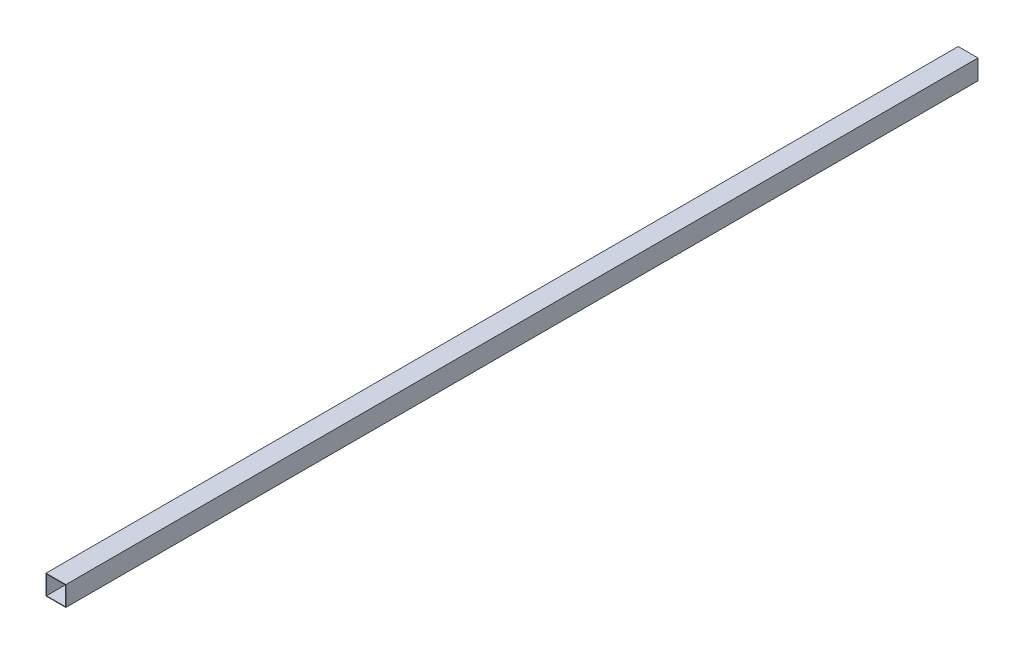
ISO-10303-21;
HEADER;
FILE_DESCRIPTION(('STEP AP214'),'2;1');
FILE_NAME('part.step','',(''),(''),'','','');
FILE_SCHEMA(('AUTOMOTIVE_DESIGN { 1 0 10303 214 1 1 1 1 }'));
ENDSEC;
DATA;
#1=APPLICATION_CONTEXT('core data for automotive mechanical design processes');
#2=APPLICATION_PROTOCOL_DEFINITION('international standard','automotive_design',2000,#1);
#3=PRODUCT_CONTEXT('',#1,'mechanical');
#4=PRODUCT('Part','Part','',(#3));
#5=PRODUCT_RELATED_PRODUCT_CATEGORY('part','',(#4));
#6=PRODUCT_DEFINITION_FORMATION('','',#4);
#7=PRODUCT_DEFINITION_CONTEXT('part definition',#1,'design');
#8=PRODUCT_DEFINITION('design','',#6,#7);
#9=PRODUCT_DEFINITION_SHAPE('','',#8);
#10=(LENGTH_UNIT() NAMED_UNIT(*) SI_UNIT(.MILLI.,.METRE.));
#11=(NAMED_UNIT(*) PLANE_ANGLE_UNIT() SI_UNIT($,.RADIAN.));
#12=(NAMED_UNIT(*) SI_UNIT($,.STERADIAN.) SOLID_ANGLE_UNIT());
#13=UNCERTAINTY_MEASURE_WITH_UNIT(LENGTH_MEASURE(1.E-05),#10,'distance_accuracy_value','');
#14=(GEOMETRIC_REPRESENTATION_CONTEXT(3) GLOBAL_UNCERTAINTY_ASSIGNED_CONTEXT((#13)) GLOBAL_UNIT_ASSIGNED_CONTEXT((#10,
#11,#12)) REPRESENTATION_CONTEXT('',''));
#15=CARTESIAN_POINT('',(0.,0.,0.));
#16=DIRECTION('',(0.,0.,1.));
#17=DIRECTION('',(1.,0.,0.));
#18=AXIS2_PLACEMENT_3D('',#15,#16,#17);
#19=CARTESIAN_POINT('',(0.,0.,1840.));
#20=DIRECTION('',(0.,0.,-1.));
#21=DIRECTION('',(-1.,0.,0.));
#22=AXIS2_PLACEMENT_3D('',#19,#20,#21);
#23=PLANE('',#22);
#24=DIRECTION('',(0.,-1.,0.));
#25=VECTOR('',#24,1.);
#26=CARTESIAN_POINT('',(0.,0.,1840.));
#27=LINE('',#26,#25);
#28=CARTESIAN_POINT('',(0.,40.,1840.));
#29=VERTEX_POINT('',#28);
#30=CARTESIAN_POINT('',(0.,0.,1840.));
#31=VERTEX_POINT('',#30);
#32=EDGE_CURVE('E136',#29,#31,#27,.T.);
#33=ORIENTED_EDGE('',*,*,#32,.T.);
#34=DIRECTION('',(1.,0.,0.));
#35=VECTOR('',#34,1.);
#36=CARTESIAN_POINT('',(0.,0.,1840.));
#37=LINE('',#36,#35);
#38=CARTESIAN_POINT('',(40.,0.,1840.));
#39=VERTEX_POINT('',#38);
#40=EDGE_CURVE('E139',#31,#39,#37,.T.);
#41=ORIENTED_EDGE('',*,*,#40,.T.);
#42=DIRECTION('',(0.,1.,0.));
#43=VECTOR('',#42,1.);
#44=CARTESIAN_POINT('',(40.,0.,1840.));
#45=LINE('',#44,#43);
#46=CARTESIAN_POINT('',(40.,40.,1840.));
#47=VERTEX_POINT('',#46);
#48=EDGE_CURVE('E142',#39,#47,#45,.T.);
#49=ORIENTED_EDGE('',*,*,#48,.T.);
#50=DIRECTION('',(-1.,0.,0.));
#51=VECTOR('',#50,1.);
#52=CARTESIAN_POINT('',(0.,40.,1840.));
#53=LINE('',#52,#51);
#54=EDGE_CURVE('E144',#47,#29,#53,.T.);
#55=ORIENTED_EDGE('',*,*,#54,.T.);
#56=EDGE_LOOP('',(#33,#41,#49,#55));
#57=FACE_BOUND('',#56,.T.);
#58=DIRECTION('',(0.,-1.,0.));
#59=VECTOR('',#58,1.);
#60=CARTESIAN_POINT('',(1.,1.,1840.));
#61=LINE('',#60,#59);
#62=CARTESIAN_POINT('',(1.,39.,1840.));
#63=VERTEX_POINT('',#62);
#64=CARTESIAN_POINT('',(1.,1.,1840.));
#65=VERTEX_POINT('',#64);
#66=EDGE_CURVE('E100',#63,#65,#61,.T.);
#67=ORIENTED_EDGE('',*,*,#66,.F.);
#68=DIRECTION('',(-1.,0.,0.));
#69=VECTOR('',#68,1.);
#70=CARTESIAN_POINT('',(1.,39.,1840.));
#71=LINE('',#70,#69);
#72=CARTESIAN_POINT('',(39.,39.,1840.));
#73=VERTEX_POINT('',#72);
#74=EDGE_CURVE('E122',#73,#63,#71,.T.);
#75=ORIENTED_EDGE('',*,*,#74,.F.);
#76=DIRECTION('',(0.,1.,0.));
#77=VECTOR('',#76,1.);
#78=CARTESIAN_POINT('',(39.,1.,1840.));
#79=LINE('',#78,#77);
#80=CARTESIAN_POINT('',(39.,1.,1840.));
#81=VERTEX_POINT('',#80);
#82=EDGE_CURVE('E120',#81,#73,#79,.T.);
#83=ORIENTED_EDGE('',*,*,#82,.F.);
#84=DIRECTION('',(1.,0.,0.));
#85=VECTOR('',#84,1.);
#86=CARTESIAN_POINT('',(1.,1.,1840.));
#87=LINE('',#86,#85);
#88=EDGE_CURVE('E108',#65,#81,#87,.T.);
#89=ORIENTED_EDGE('',*,*,#88,.F.);
#90=EDGE_LOOP('',(#67,#75,#83,#89));
#91=FACE_BOUND('',#90,.T.);
#92=ADVANCED_FACE('F35',(#57,#91),#23,.F.);
#93=CARTESIAN_POINT('',(0.,0.,0.));
#94=DIRECTION('',(0.,0.,-1.));
#95=DIRECTION('',(-1.,0.,0.));
#96=AXIS2_PLACEMENT_3D('',#93,#94,#95);
#97=PLANE('',#96);
#98=DIRECTION('',(0.,-1.,0.));
#99=VECTOR('',#98,1.);
#100=CARTESIAN_POINT('',(0.,0.,0.));
#101=LINE('',#100,#99);
#102=CARTESIAN_POINT('',(0.,40.,0.));
#103=VERTEX_POINT('',#102);
#104=CARTESIAN_POINT('',(0.,0.,0.));
#105=VERTEX_POINT('',#104);
#106=EDGE_CURVE('E116',#103,#105,#101,.T.);
#107=ORIENTED_EDGE('',*,*,#106,.F.);
#108=DIRECTION('',(-1.,0.,0.));
#109=VECTOR('',#108,1.);
#110=CARTESIAN_POINT('',(0.,40.,0.));
#111=LINE('',#110,#109);
#112=CARTESIAN_POINT('',(40.,40.,0.));
#113=VERTEX_POINT('',#112);
#114=EDGE_CURVE('E140',#113,#103,#111,.T.);
#115=ORIENTED_EDGE('',*,*,#114,.F.);
#116=DIRECTION('',(0.,1.,0.));
#117=VECTOR('',#116,1.);
#118=CARTESIAN_POINT('',(40.,0.,0.));
#119=LINE('',#118,#117);
#120=CARTESIAN_POINT('',(40.,0.,0.));
#121=VERTEX_POINT('',#120);
#122=EDGE_CURVE('E151',#121,#113,#119,.T.);
#123=ORIENTED_EDGE('',*,*,#122,.F.);
#124=DIRECTION('',(1.,0.,0.));
#125=VECTOR('',#124,1.);
#126=CARTESIAN_POINT('',(0.,0.,0.));
#127=LINE('',#126,#125);
#128=EDGE_CURVE('E149',#105,#121,#127,.T.);
#129=ORIENTED_EDGE('',*,*,#128,.F.);
#130=EDGE_LOOP('',(#107,#115,#123,#129));
#131=FACE_BOUND('',#130,.T.);
#132=DIRECTION('',(-1.,0.,0.));
#133=VECTOR('',#132,1.);
#134=CARTESIAN_POINT('',(1.,39.,0.));
#135=LINE('',#134,#133);
#136=CARTESIAN_POINT('',(39.,39.,0.));
#137=VERTEX_POINT('',#136);
#138=CARTESIAN_POINT('',(1.,39.,0.));
#139=VERTEX_POINT('',#138);
#140=EDGE_CURVE('E109',#137,#139,#135,.T.);
#141=ORIENTED_EDGE('',*,*,#140,.T.);
#142=DIRECTION('',(0.,-1.,0.));
#143=VECTOR('',#142,1.);
#144=CARTESIAN_POINT('',(1.,1.,0.));
#145=LINE('',#144,#143);
#146=CARTESIAN_POINT('',(1.,1.,0.));
#147=VERTEX_POINT('',#146);
#148=EDGE_CURVE('E58',#139,#147,#145,.T.);
#149=ORIENTED_EDGE('',*,*,#148,.T.);
#150=DIRECTION('',(1.,0.,0.));
#151=VECTOR('',#150,1.);
#152=CARTESIAN_POINT('',(1.,1.,0.));
#153=LINE('',#152,#151);
#154=CARTESIAN_POINT('',(39.,1.,0.));
#155=VERTEX_POINT('',#154);
#156=EDGE_CURVE('E115',#147,#155,#153,.T.);
#157=ORIENTED_EDGE('',*,*,#156,.T.);
#158=DIRECTION('',(0.,1.,0.));
#159=VECTOR('',#158,1.);
#160=CARTESIAN_POINT('',(39.,1.,0.));
#161=LINE('',#160,#159);
#162=EDGE_CURVE('E128',#155,#137,#161,.T.);
#163=ORIENTED_EDGE('',*,*,#162,.T.);
#164=EDGE_LOOP('',(#141,#149,#157,#163));
#165=FACE_BOUND('',#164,.T.);
#166=ADVANCED_FACE('F169',(#131,#165),#97,.T.);
#167=CARTESIAN_POINT('',(0.,0.,1840.));
#168=DIRECTION('',(1.,0.,0.));
#169=DIRECTION('',(0.,0.,-1.));
#170=AXIS2_PLACEMENT_3D('',#167,#168,#169);
#171=PLANE('',#170);
#172=ORIENTED_EDGE('',*,*,#106,.T.);
#173=DIRECTION('',(0.,0.,-1.));
#174=VECTOR('',#173,1.);
#175=CARTESIAN_POINT('',(0.,0.,1840.));
#176=LINE('',#175,#174);
#177=EDGE_CURVE('E11',#31,#105,#176,.T.);
#178=ORIENTED_EDGE('',*,*,#177,.F.);
#179=ORIENTED_EDGE('',*,*,#32,.F.);
#180=DIRECTION('',(0.,0.,-1.));
#181=VECTOR('',#180,1.);
#182=CARTESIAN_POINT('',(0.,40.,1840.));
#183=LINE('',#182,#181);
#184=EDGE_CURVE('E146',#29,#103,#183,.T.);
#185=ORIENTED_EDGE('',*,*,#184,.T.);
#186=EDGE_LOOP('',(#172,#178,#179,#185));
#187=FACE_BOUND('',#186,.T.);
#188=ADVANCED_FACE('F37',(#187),#171,.F.);
#189=CARTESIAN_POINT('',(0.,0.,1840.));
#190=DIRECTION('',(0.,1.,0.));
#191=DIRECTION('',(0.,0.,1.));
#192=AXIS2_PLACEMENT_3D('',#189,#190,#191);
#193=PLANE('',#192);
#194=ORIENTED_EDGE('',*,*,#128,.T.);
#195=DIRECTION('',(0.,0.,-1.));
#196=VECTOR('',#195,1.);
#197=CARTESIAN_POINT('',(40.,0.,1840.));
#198=LINE('',#197,#196);
#199=EDGE_CURVE('E43',#39,#121,#198,.T.);
#200=ORIENTED_EDGE('',*,*,#199,.F.);
#201=ORIENTED_EDGE('',*,*,#40,.F.);
#202=ORIENTED_EDGE('',*,*,#177,.T.);
#203=EDGE_LOOP('',(#194,#200,#201,#202));
#204=FACE_BOUND('',#203,.T.);
#205=ADVANCED_FACE('F179',(#204),#193,.F.);
#206=CARTESIAN_POINT('',(40.,0.,1840.));
#207=DIRECTION('',(-1.,0.,0.));
#208=DIRECTION('',(0.,0.,1.));
#209=AXIS2_PLACEMENT_3D('',#206,#207,#208);
#210=PLANE('',#209);
#211=ORIENTED_EDGE('',*,*,#122,.T.);
#212=DIRECTION('',(0.,0.,-1.));
#213=VECTOR('',#212,1.);
#214=CARTESIAN_POINT('',(40.,40.,1840.));
#215=LINE('',#214,#213);
#216=EDGE_CURVE('E156',#47,#113,#215,.T.);
#217=ORIENTED_EDGE('',*,*,#216,.F.);
#218=ORIENTED_EDGE('',*,*,#48,.F.);
#219=ORIENTED_EDGE('',*,*,#199,.T.);
#220=EDGE_LOOP('',(#211,#217,#218,#219));
#221=FACE_BOUND('',#220,.T.);
#222=ADVANCED_FACE('F163',(#221),#210,.F.);
#223=CARTESIAN_POINT('',(0.,40.,1840.));
#224=DIRECTION('',(0.,-1.,0.));
#225=DIRECTION('',(0.,0.,-1.));
#226=AXIS2_PLACEMENT_3D('',#223,#224,#225);
#227=PLANE('',#226);
#228=ORIENTED_EDGE('',*,*,#114,.T.);
#229=ORIENTED_EDGE('',*,*,#184,.F.);
#230=ORIENTED_EDGE('',*,*,#54,.F.);
#231=ORIENTED_EDGE('',*,*,#216,.T.);
#232=EDGE_LOOP('',(#228,#229,#230,#231));
#233=FACE_BOUND('',#232,.T.);
#234=ADVANCED_FACE('F173',(#233),#227,.F.);
#235=CARTESIAN_POINT('',(1.,1.,1840.));
#236=DIRECTION('',(1.,0.,0.));
#237=DIRECTION('',(0.,0.,-1.));
#238=AXIS2_PLACEMENT_3D('',#235,#236,#237);
#239=PLANE('',#238);
#240=ORIENTED_EDGE('',*,*,#148,.F.);
#241=DIRECTION('',(0.,0.,-1.));
#242=VECTOR('',#241,1.);
#243=CARTESIAN_POINT('',(1.,39.,1840.));
#244=LINE('',#243,#242);
#245=EDGE_CURVE('E104',#63,#139,#244,.T.);
#246=ORIENTED_EDGE('',*,*,#245,.F.);
#247=ORIENTED_EDGE('',*,*,#66,.T.);
#248=DIRECTION('',(0.,0.,-1.));
#249=VECTOR('',#248,1.);
#250=CARTESIAN_POINT('',(1.,1.,1840.));
#251=LINE('',#250,#249);
#252=EDGE_CURVE('E103',#65,#147,#251,.T.);
#253=ORIENTED_EDGE('',*,*,#252,.T.);
#254=EDGE_LOOP('',(#240,#246,#247,#253));
#255=FACE_BOUND('',#254,.T.);
#256=ADVANCED_FACE('F102',(#255),#239,.T.);
#257=CARTESIAN_POINT('',(1.,1.,1840.));
#258=DIRECTION('',(0.,1.,0.));
#259=DIRECTION('',(-1.,0.,0.));
#260=AXIS2_PLACEMENT_3D('',#257,#258,#259);
#261=PLANE('',#260);
#262=ORIENTED_EDGE('',*,*,#156,.F.);
#263=ORIENTED_EDGE('',*,*,#252,.F.);
#264=ORIENTED_EDGE('',*,*,#88,.T.);
#265=DIRECTION('',(0.,0.,-1.));
#266=VECTOR('',#265,1.);
#267=CARTESIAN_POINT('',(39.,1.,1840.));
#268=LINE('',#267,#266);
#269=EDGE_CURVE('E117',#81,#155,#268,.T.);
#270=ORIENTED_EDGE('',*,*,#269,.T.);
#271=EDGE_LOOP('',(#262,#263,#264,#270));
#272=FACE_BOUND('',#271,.T.);
#273=ADVANCED_FACE('F112',(#272),#261,.T.);
#274=CARTESIAN_POINT('',(39.,1.,1840.));
#275=DIRECTION('',(-1.,0.,0.));
#276=DIRECTION('',(0.,0.,1.));
#277=AXIS2_PLACEMENT_3D('',#274,#275,#276);
#278=PLANE('',#277);
#279=ORIENTED_EDGE('',*,*,#162,.F.);
#280=ORIENTED_EDGE('',*,*,#269,.F.);
#281=ORIENTED_EDGE('',*,*,#82,.T.);
#282=DIRECTION('',(0.,0.,-1.));
#283=VECTOR('',#282,1.);
#284=CARTESIAN_POINT('',(39.,39.,1840.));
#285=LINE('',#284,#283);
#286=EDGE_CURVE('E50',#73,#137,#285,.T.);
#287=ORIENTED_EDGE('',*,*,#286,.T.);
#288=EDGE_LOOP('',(#279,#280,#281,#287));
#289=FACE_BOUND('',#288,.T.);
#290=ADVANCED_FACE('F202',(#289),#278,.T.);
#291=CARTESIAN_POINT('',(1.,39.,1840.));
#292=DIRECTION('',(0.,-1.,0.));
#293=DIRECTION('',(0.,0.,-1.));
#294=AXIS2_PLACEMENT_3D('',#291,#292,#293);
#295=PLANE('',#294);
#296=ORIENTED_EDGE('',*,*,#140,.F.);
#297=ORIENTED_EDGE('',*,*,#286,.F.);
#298=ORIENTED_EDGE('',*,*,#74,.T.);
#299=ORIENTED_EDGE('',*,*,#245,.T.);
#300=EDGE_LOOP('',(#296,#297,#298,#299));
#301=FACE_BOUND('',#300,.T.);
#302=ADVANCED_FACE('F206',(#301),#295,.T.);
#303=CLOSED_SHELL('',(#92,#166,#188,#205,#222,#234,#256,#273,#290,#302));
#304=MANIFOLD_SOLID_BREP('B2',#303);
#305=ADVANCED_BREP_SHAPE_REPRESENTATION('',(#18,#304),#14);
#306=SHAPE_DEFINITION_REPRESENTATION(#9,#305);
ENDSEC;
END-ISO-10303-21;
